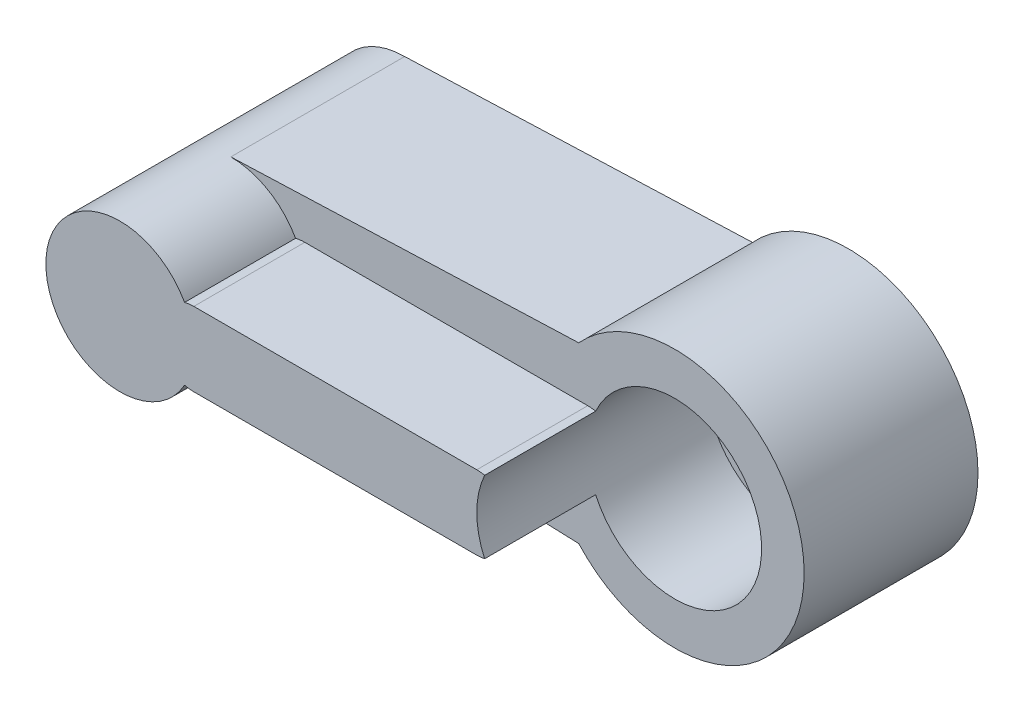
ISO-10303-21;
HEADER;
FILE_DESCRIPTION(('STEP AP214'),'2;1');
FILE_NAME('part.step','',(''),(''),'','','');
FILE_SCHEMA(('AUTOMOTIVE_DESIGN { 1 0 10303 214 1 1 1 1 }'));
ENDSEC;
DATA;
#1=APPLICATION_CONTEXT('core data for automotive mechanical design processes');
#2=APPLICATION_PROTOCOL_DEFINITION('international standard','automotive_design',2000,#1);
#3=PRODUCT_CONTEXT('',#1,'mechanical');
#4=PRODUCT('Part','Part','',(#3));
#5=PRODUCT_RELATED_PRODUCT_CATEGORY('part','',(#4));
#6=PRODUCT_DEFINITION_FORMATION('','',#4);
#7=PRODUCT_DEFINITION_CONTEXT('part definition',#1,'design');
#8=PRODUCT_DEFINITION('design','',#6,#7);
#9=PRODUCT_DEFINITION_SHAPE('','',#8);
#10=(LENGTH_UNIT() NAMED_UNIT(*) SI_UNIT(.MILLI.,.METRE.));
#11=(NAMED_UNIT(*) PLANE_ANGLE_UNIT() SI_UNIT($,.RADIAN.));
#12=(NAMED_UNIT(*) SI_UNIT($,.STERADIAN.) SOLID_ANGLE_UNIT());
#13=UNCERTAINTY_MEASURE_WITH_UNIT(LENGTH_MEASURE(1.E-05),#10,'distance_accuracy_value','');
#14=(GEOMETRIC_REPRESENTATION_CONTEXT(3) GLOBAL_UNCERTAINTY_ASSIGNED_CONTEXT((#13)) GLOBAL_UNIT_ASSIGNED_CONTEXT((#10,
#11,#12)) REPRESENTATION_CONTEXT('',''));
#15=CARTESIAN_POINT('',(0.,0.,0.));
#16=DIRECTION('',(0.,0.,1.));
#17=DIRECTION('',(1.,0.,0.));
#18=AXIS2_PLACEMENT_3D('',#15,#16,#17);
#19=CARTESIAN_POINT('',(1.06048202477386,0.,6.7));
#20=DIRECTION('',(0.,0.,-1.));
#21=DIRECTION('',(-1.,0.,0.));
#22=AXIS2_PLACEMENT_3D('',#19,#20,#21);
#23=CYLINDRICAL_SURFACE('',#22,2.35);
#24=CARTESIAN_POINT('',(1.06048202477386,0.,6.7));
#25=DIRECTION('',(0.,0.,1.));
#26=DIRECTION('',(1.,0.,0.));
#27=AXIS2_PLACEMENT_3D('',#24,#25,#26);
#28=CIRCLE('',#27,2.35);
#29=CARTESIAN_POINT('',(-1.07675201777933,-0.977103191762131,6.7));
#30=VERTEX_POINT('',#29);
#31=CARTESIAN_POINT('',(-1.07675201777933,0.977103191762131,6.7));
#32=VERTEX_POINT('',#31);
#33=EDGE_CURVE('E171',#30,#32,#28,.T.);
#34=ORIENTED_EDGE('',*,*,#33,.T.);
#35=DIRECTION('',(0.,0.,-1.));
#36=VECTOR('',#35,1.);
#37=CARTESIAN_POINT('',(-1.07675201777933,0.977103191762131,9.7));
#38=LINE('',#37,#36);
#39=CARTESIAN_POINT('',(-1.07675201777933,0.977103191762131,9.7));
#40=VERTEX_POINT('',#39);
#41=EDGE_CURVE('E203',#40,#32,#38,.T.);
#42=ORIENTED_EDGE('',*,*,#41,.F.);
#43=CARTESIAN_POINT('',(1.06048202477386,0.,9.7));
#44=DIRECTION('',(0.,0.,-1.));
#45=DIRECTION('',(1.,0.,0.));
#46=AXIS2_PLACEMENT_3D('',#43,#44,#45);
#47=CIRCLE('',#46,2.35);
#48=CARTESIAN_POINT('',(-1.07675201777933,-0.977103191762131,9.7));
#49=VERTEX_POINT('',#48);
#50=EDGE_CURVE('E244',#49,#40,#47,.T.);
#51=ORIENTED_EDGE('',*,*,#50,.F.);
#52=DIRECTION('',(0.,0.,-1.));
#53=VECTOR('',#52,1.);
#54=CARTESIAN_POINT('',(-1.07675201777933,-0.977103191762131,9.7));
#55=LINE('',#54,#53);
#56=EDGE_CURVE('E199',#49,#30,#55,.T.);
#57=ORIENTED_EDGE('',*,*,#56,.T.);
#58=EDGE_LOOP('',(#34,#42,#51,#57));
#59=FACE_BOUND('',#58,.T.);
#60=CARTESIAN_POINT('',(1.06048202477387,0.,3.5));
#61=DIRECTION('',(0.,0.,-1.));
#62=DIRECTION('',(-1.,0.,0.));
#63=AXIS2_PLACEMENT_3D('',#60,#61,#62);
#64=CIRCLE('',#63,2.35);
#65=CARTESIAN_POINT('',(-1.28951797522614,0.,3.5));
#66=VERTEX_POINT('',#65);
#67=EDGE_CURVE('E145',#66,#66,#64,.T.);
#68=ORIENTED_EDGE('',*,*,#67,.T.);
#69=EDGE_LOOP('',(#68));
#70=FACE_BOUND('',#69,.T.);
#71=ADVANCED_FACE('F45',(#59,#70),#23,.F.);
#72=CARTESIAN_POINT('',(-0.089440802020708,2.40372347859468,6.7));
#73=DIRECTION('',(-0.0371835405784303,0.999308453036425,0.));
#74=DIRECTION('',(-0.999308453036425,-0.0371835405784303,0.));
#75=AXIS2_PLACEMENT_3D('',#72,#73,#74);
#76=PLANE('',#75);
#77=DIRECTION('',(0.,0.,-1.));
#78=VECTOR('',#77,1.);
#79=CARTESIAN_POINT('',(-1.53326044509472,2.35000000000001,6.7));
#80=LINE('',#79,#78);
#81=CARTESIAN_POINT('',(-1.53326044509472,2.35000000000001,6.7));
#82=VERTEX_POINT('',#81);
#83=CARTESIAN_POINT('',(-1.53326044509472,2.35000000000001,2.));
#84=VERTEX_POINT('',#83);
#85=EDGE_CURVE('E152',#82,#84,#80,.T.);
#86=ORIENTED_EDGE('',*,*,#85,.T.);
#87=DIRECTION('',(0.999308453036425,0.0371835405784326,0.));
#88=VECTOR('',#87,1.);
#89=CARTESIAN_POINT('',(-10.9395179752261,1.99999999999993,2.));
#90=LINE('',#89,#88);
#91=CARTESIAN_POINT('',(-10.9395179752261,1.99999999999993,2.));
#92=VERTEX_POINT('',#91);
#93=EDGE_CURVE('E63',#92,#84,#90,.T.);
#94=ORIENTED_EDGE('',*,*,#93,.F.);
#95=DIRECTION('',(0.,0.,-1.));
#96=VECTOR('',#95,1.);
#97=CARTESIAN_POINT('',(-10.9395179752261,1.99999999999993,6.7));
#98=LINE('',#97,#96);
#99=CARTESIAN_POINT('',(-10.9395179752261,1.99999999999993,6.7));
#100=VERTEX_POINT('',#99);
#101=EDGE_CURVE('E49',#100,#92,#98,.T.);
#102=ORIENTED_EDGE('',*,*,#101,.F.);
#103=DIRECTION('',(0.999308453036425,0.0371835405784303,0.));
#104=VECTOR('',#103,1.);
#105=CARTESIAN_POINT('',(-0.089440802020708,2.40372347859468,6.7));
#106=LINE('',#105,#104);
#107=EDGE_CURVE('E181',#100,#82,#106,.T.);
#108=ORIENTED_EDGE('',*,*,#107,.T.);
#109=EDGE_LOOP('',(#86,#94,#102,#108));
#110=FACE_BOUND('',#109,.T.);
#111=ADVANCED_FACE('F47',(#110),#76,.T.);
#112=CARTESIAN_POINT('',(-10.9395179752261,0.,6.7));
#113=DIRECTION('',(0.,0.,-1.));
#114=DIRECTION('',(-1.,0.,0.));
#115=AXIS2_PLACEMENT_3D('',#112,#113,#114);
#116=CYLINDRICAL_SURFACE('',#115,2.);
#117=CARTESIAN_POINT('',(-10.9395179752261,0.,2.));
#118=DIRECTION('',(0.,0.,-1.));
#119=DIRECTION('',(-1.,0.,0.));
#120=AXIS2_PLACEMENT_3D('',#117,#118,#119);
#121=CIRCLE('',#120,1.99999999999999);
#122=CARTESIAN_POINT('',(-10.9395179752261,-2.00000000000005,2.));
#123=VERTEX_POINT('',#122);
#124=EDGE_CURVE('E135',#123,#92,#121,.T.);
#125=ORIENTED_EDGE('',*,*,#124,.F.);
#126=DIRECTION('',(0.,0.,-1.));
#127=VECTOR('',#126,1.);
#128=CARTESIAN_POINT('',(-10.9395179752261,-2.00000000000005,6.7));
#129=LINE('',#128,#127);
#130=CARTESIAN_POINT('',(-10.9395179752261,-2.00000000000005,6.7));
#131=VERTEX_POINT('',#130);
#132=EDGE_CURVE('E160',#131,#123,#129,.T.);
#133=ORIENTED_EDGE('',*,*,#132,.F.);
#134=CARTESIAN_POINT('',(-10.9395179752261,0.,6.7));
#135=DIRECTION('',(0.,0.,1.));
#136=DIRECTION('',(1.,0.,0.));
#137=AXIS2_PLACEMENT_3D('',#134,#135,#136);
#138=CIRCLE('',#137,2.);
#139=CARTESIAN_POINT('',(-9.18951797522613,-0.968245836551952,6.7));
#140=VERTEX_POINT('',#139);
#141=EDGE_CURVE('E11',#131,#140,#138,.T.);
#142=ORIENTED_EDGE('',*,*,#141,.T.);
#143=DIRECTION('',(0.,0.,-1.));
#144=VECTOR('',#143,1.);
#145=CARTESIAN_POINT('',(-9.18951797522613,-0.968245836551952,9.7));
#146=LINE('',#145,#144);
#147=CARTESIAN_POINT('',(-9.18951797522613,-0.968245836551952,9.7));
#148=VERTEX_POINT('',#147);
#149=EDGE_CURVE('E187',#148,#140,#146,.T.);
#150=ORIENTED_EDGE('',*,*,#149,.F.);
#151=CARTESIAN_POINT('',(-10.9395179752261,0.,9.7));
#152=DIRECTION('',(0.,0.,1.));
#153=DIRECTION('',(1.,0.,0.));
#154=AXIS2_PLACEMENT_3D('',#151,#152,#153);
#155=CIRCLE('',#154,2.);
#156=CARTESIAN_POINT('',(-9.18951797522623,0.968245836551927,9.7));
#157=VERTEX_POINT('',#156);
#158=EDGE_CURVE('E256',#157,#148,#155,.T.);
#159=ORIENTED_EDGE('',*,*,#158,.F.);
#160=DIRECTION('',(0.,0.,-1.));
#161=VECTOR('',#160,1.);
#162=CARTESIAN_POINT('',(-9.18951797522623,0.968245836551927,9.7));
#163=LINE('',#162,#161);
#164=CARTESIAN_POINT('',(-9.18951797522623,0.968245836551927,6.7));
#165=VERTEX_POINT('',#164);
#166=EDGE_CURVE('E184',#157,#165,#163,.T.);
#167=ORIENTED_EDGE('',*,*,#166,.T.);
#168=EDGE_CURVE('E56',#165,#100,#138,.T.);
#169=ORIENTED_EDGE('',*,*,#168,.T.);
#170=ORIENTED_EDGE('',*,*,#101,.T.);
#171=EDGE_LOOP('',(#125,#133,#142,#150,#159,#167,#169,#170));
#172=FACE_BOUND('',#171,.T.);
#173=ADVANCED_FACE('F157',(#172),#116,.T.);
#174=CARTESIAN_POINT('',(-0.0894408020206935,-2.40372347859467,6.7));
#175=DIRECTION('',(0.0371835405784244,0.999308453036425,0.));
#176=DIRECTION('',(-0.999308453036425,0.0371835405784244,0.));
#177=AXIS2_PLACEMENT_3D('',#174,#175,#176);
#178=PLANE('',#177);
#179=DIRECTION('',(-0.999308453036425,0.0371835405784195,0.));
#180=VECTOR('',#179,1.);
#181=CARTESIAN_POINT('',(-1.53326044509472,-2.35000000000001,2.));
#182=LINE('',#181,#180);
#183=CARTESIAN_POINT('',(-1.53326044509472,-2.35000000000001,2.));
#184=VERTEX_POINT('',#183);
#185=EDGE_CURVE('E139',#184,#123,#182,.T.);
#186=ORIENTED_EDGE('',*,*,#185,.F.);
#187=DIRECTION('',(0.,0.,-1.));
#188=VECTOR('',#187,1.);
#189=CARTESIAN_POINT('',(-1.53326044509472,-2.35000000000001,6.7));
#190=LINE('',#189,#188);
#191=CARTESIAN_POINT('',(-1.53326044509472,-2.35000000000001,6.7));
#192=VERTEX_POINT('',#191);
#193=EDGE_CURVE('E162',#192,#184,#190,.T.);
#194=ORIENTED_EDGE('',*,*,#193,.F.);
#195=DIRECTION('',(0.999308453036425,-0.0371835405784244,0.));
#196=VECTOR('',#195,1.);
#197=CARTESIAN_POINT('',(-0.0894408020206935,-2.40372347859467,6.7));
#198=LINE('',#197,#196);
#199=EDGE_CURVE('E178',#131,#192,#198,.T.);
#200=ORIENTED_EDGE('',*,*,#199,.F.);
#201=ORIENTED_EDGE('',*,*,#132,.T.);
#202=EDGE_LOOP('',(#186,#194,#200,#201));
#203=FACE_BOUND('',#202,.T.);
#204=ADVANCED_FACE('F311',(#203),#178,.F.);
#205=CARTESIAN_POINT('',(1.06048202477386,0.,6.7));
#206=DIRECTION('',(0.,0.,-1.));
#207=DIRECTION('',(-1.,0.,0.));
#208=AXIS2_PLACEMENT_3D('',#205,#206,#207);
#209=CYLINDRICAL_SURFACE('',#208,3.5);
#210=CARTESIAN_POINT('',(1.06048202477386,0.,2.));
#211=DIRECTION('',(0.,0.,-1.));
#212=DIRECTION('',(-1.,0.,0.));
#213=AXIS2_PLACEMENT_3D('',#210,#211,#212);
#214=CIRCLE('',#213,3.5);
#215=EDGE_CURVE('E154',#84,#184,#214,.T.);
#216=ORIENTED_EDGE('',*,*,#215,.F.);
#217=ORIENTED_EDGE('',*,*,#85,.F.);
#218=CARTESIAN_POINT('',(1.06048202477386,0.,6.7));
#219=DIRECTION('',(0.,0.,1.));
#220=DIRECTION('',(1.,0.,0.));
#221=AXIS2_PLACEMENT_3D('',#218,#219,#220);
#222=CIRCLE('',#221,3.5);
#223=EDGE_CURVE('E175',#192,#82,#222,.T.);
#224=ORIENTED_EDGE('',*,*,#223,.F.);
#225=ORIENTED_EDGE('',*,*,#193,.T.);
#226=EDGE_LOOP('',(#216,#217,#224,#225));
#227=FACE_BOUND('',#226,.T.);
#228=ADVANCED_FACE('F308',(#227),#209,.T.);
#229=CARTESIAN_POINT('',(0.,0.,6.7));
#230=DIRECTION('',(0.,0.,1.));
#231=DIRECTION('',(1.,0.,0.));
#232=AXIS2_PLACEMENT_3D('',#229,#230,#231);
#233=PLANE('',#232);
#234=CARTESIAN_POINT('',(-1.28951797522614,0.,6.7));
#235=DIRECTION('',(0.,0.,1.));
#236=DIRECTION('',(1.,0.,0.));
#237=AXIS2_PLACEMENT_3D('',#234,#235,#236);
#238=CIRCLE('',#237,1.);
#239=CARTESIAN_POINT('',(-1.28951797522614,1.,6.7));
#240=VERTEX_POINT('',#239);
#241=EDGE_CURVE('E219',#32,#240,#238,.T.);
#242=ORIENTED_EDGE('',*,*,#241,.F.);
#243=ORIENTED_EDGE('',*,*,#33,.F.);
#244=CARTESIAN_POINT('',(-1.28951797522614,0.,6.7));
#245=DIRECTION('',(0.,0.,1.));
#246=DIRECTION('',(1.,0.,0.));
#247=AXIS2_PLACEMENT_3D('',#244,#245,#246);
#248=CIRCLE('',#247,1.);
#249=CARTESIAN_POINT('',(-1.28951797522614,-1.,6.7));
#250=VERTEX_POINT('',#249);
#251=EDGE_CURVE('E222',#250,#30,#248,.T.);
#252=ORIENTED_EDGE('',*,*,#251,.F.);
#253=DIRECTION('',(1.,0.,0.));
#254=VECTOR('',#253,1.);
#255=CARTESIAN_POINT('',(-8.93951797522613,-1.,6.7));
#256=LINE('',#255,#254);
#257=CARTESIAN_POINT('',(-8.93951797522613,-1.00000000000005,6.7));
#258=VERTEX_POINT('',#257);
#259=EDGE_CURVE('E226',#258,#250,#256,.T.);
#260=ORIENTED_EDGE('',*,*,#259,.F.);
#261=CARTESIAN_POINT('',(-8.93951797522613,0.,6.7));
#262=DIRECTION('',(0.,0.,1.));
#263=DIRECTION('',(1.,0.,0.));
#264=AXIS2_PLACEMENT_3D('',#261,#262,#263);
#265=CIRCLE('',#264,0.999999999999952);
#266=EDGE_CURVE('E230',#140,#258,#265,.T.);
#267=ORIENTED_EDGE('',*,*,#266,.F.);
#268=ORIENTED_EDGE('',*,*,#141,.F.);
#269=ORIENTED_EDGE('',*,*,#199,.T.);
#270=ORIENTED_EDGE('',*,*,#223,.T.);
#271=ORIENTED_EDGE('',*,*,#107,.F.);
#272=ORIENTED_EDGE('',*,*,#168,.F.);
#273=CARTESIAN_POINT('',(-8.93951797522613,0.,6.7));
#274=DIRECTION('',(0.,0.,1.));
#275=DIRECTION('',(1.,0.,0.));
#276=AXIS2_PLACEMENT_3D('',#273,#274,#275);
#277=CIRCLE('',#276,1.00000000000014);
#278=CARTESIAN_POINT('',(-8.93951797522613,1.,6.7));
#279=VERTEX_POINT('',#278);
#280=EDGE_CURVE('E235',#279,#165,#277,.T.);
#281=ORIENTED_EDGE('',*,*,#280,.F.);
#282=DIRECTION('',(-1.,0.,0.));
#283=VECTOR('',#282,1.);
#284=CARTESIAN_POINT('',(-8.93951797522613,1.,6.7));
#285=LINE('',#284,#283);
#286=EDGE_CURVE('E71',#240,#279,#285,.T.);
#287=ORIENTED_EDGE('',*,*,#286,.F.);
#288=EDGE_LOOP('',(#242,#243,#252,#260,#267,#268,#269,#270,#271,#272,#281,#287));
#289=FACE_BOUND('',#288,.T.);
#290=ADVANCED_FACE('F306',(#289),#233,.T.);
#291=CARTESIAN_POINT('',(-8.93951797522613,0.,9.7));
#292=DIRECTION('',(0.,0.,-1.));
#293=DIRECTION('',(-1.,0.,0.));
#294=AXIS2_PLACEMENT_3D('',#291,#292,#293);
#295=CYLINDRICAL_SURFACE('',#294,1.00000000000014);
#296=ORIENTED_EDGE('',*,*,#280,.T.);
#297=ORIENTED_EDGE('',*,*,#166,.F.);
#298=CARTESIAN_POINT('',(-8.93951797522613,0.,9.7));
#299=DIRECTION('',(0.,0.,1.));
#300=DIRECTION('',(1.,0.,0.));
#301=AXIS2_PLACEMENT_3D('',#298,#299,#300);
#302=CIRCLE('',#301,1.00000000000014);
#303=CARTESIAN_POINT('',(-8.93951797522613,1.,9.7));
#304=VERTEX_POINT('',#303);
#305=EDGE_CURVE('E218',#304,#157,#302,.T.);
#306=ORIENTED_EDGE('',*,*,#305,.F.);
#307=DIRECTION('',(0.,0.,-1.));
#308=VECTOR('',#307,1.);
#309=CARTESIAN_POINT('',(-8.93951797522613,1.,9.7));
#310=LINE('',#309,#308);
#311=EDGE_CURVE('E211',#304,#279,#310,.T.);
#312=ORIENTED_EDGE('',*,*,#311,.T.);
#313=EDGE_LOOP('',(#296,#297,#306,#312));
#314=FACE_BOUND('',#313,.T.);
#315=ADVANCED_FACE('F333',(#314),#295,.T.);
#316=CARTESIAN_POINT('',(-8.93951797522613,0.,9.7));
#317=DIRECTION('',(0.,0.,-1.));
#318=DIRECTION('',(-1.,0.,0.));
#319=AXIS2_PLACEMENT_3D('',#316,#317,#318);
#320=CYLINDRICAL_SURFACE('',#319,0.999999999999952);
#321=ORIENTED_EDGE('',*,*,#266,.T.);
#322=DIRECTION('',(0.,0.,-1.));
#323=VECTOR('',#322,1.);
#324=CARTESIAN_POINT('',(-8.93951797522613,-1.00000000000005,9.7));
#325=LINE('',#324,#323);
#326=CARTESIAN_POINT('',(-8.93951797522613,-1.00000000000005,9.7));
#327=VERTEX_POINT('',#326);
#328=EDGE_CURVE('E191',#327,#258,#325,.T.);
#329=ORIENTED_EDGE('',*,*,#328,.F.);
#330=CARTESIAN_POINT('',(-8.93951797522613,0.,9.7));
#331=DIRECTION('',(0.,0.,1.));
#332=DIRECTION('',(1.,0.,0.));
#333=AXIS2_PLACEMENT_3D('',#330,#331,#332);
#334=CIRCLE('',#333,0.999999999999952);
#335=EDGE_CURVE('E253',#148,#327,#334,.T.);
#336=ORIENTED_EDGE('',*,*,#335,.F.);
#337=ORIENTED_EDGE('',*,*,#149,.T.);
#338=EDGE_LOOP('',(#321,#329,#336,#337));
#339=FACE_BOUND('',#338,.T.);
#340=ADVANCED_FACE('F339',(#339),#320,.T.);
#341=CARTESIAN_POINT('',(-8.93951797522613,-1.,9.7));
#342=DIRECTION('',(0.,1.,0.));
#343=DIRECTION('',(0.,0.,1.));
#344=AXIS2_PLACEMENT_3D('',#341,#342,#343);
#345=PLANE('',#344);
#346=ORIENTED_EDGE('',*,*,#259,.T.);
#347=DIRECTION('',(0.,0.,-1.));
#348=VECTOR('',#347,1.);
#349=CARTESIAN_POINT('',(-1.28951797522614,-1.,9.7));
#350=LINE('',#349,#348);
#351=CARTESIAN_POINT('',(-1.28951797522614,-1.,9.7));
#352=VERTEX_POINT('',#351);
#353=EDGE_CURVE('E195',#352,#250,#350,.T.);
#354=ORIENTED_EDGE('',*,*,#353,.F.);
#355=DIRECTION('',(1.,0.,0.));
#356=VECTOR('',#355,1.);
#357=CARTESIAN_POINT('',(-8.93951797522613,-1.,9.7));
#358=LINE('',#357,#356);
#359=EDGE_CURVE('E250',#327,#352,#358,.T.);
#360=ORIENTED_EDGE('',*,*,#359,.F.);
#361=ORIENTED_EDGE('',*,*,#328,.T.);
#362=EDGE_LOOP('',(#346,#354,#360,#361));
#363=FACE_BOUND('',#362,.T.);
#364=ADVANCED_FACE('F346',(#363),#345,.F.);
#365=CARTESIAN_POINT('',(-1.28951797522614,0.,9.7));
#366=DIRECTION('',(0.,0.,-1.));
#367=DIRECTION('',(-1.,0.,0.));
#368=AXIS2_PLACEMENT_3D('',#365,#366,#367);
#369=CYLINDRICAL_SURFACE('',#368,1.);
#370=ORIENTED_EDGE('',*,*,#251,.T.);
#371=ORIENTED_EDGE('',*,*,#56,.F.);
#372=CARTESIAN_POINT('',(-1.28951797522614,0.,9.7));
#373=DIRECTION('',(0.,0.,1.));
#374=DIRECTION('',(1.,0.,0.));
#375=AXIS2_PLACEMENT_3D('',#372,#373,#374);
#376=CIRCLE('',#375,1.);
#377=EDGE_CURVE('E247',#352,#49,#376,.T.);
#378=ORIENTED_EDGE('',*,*,#377,.F.);
#379=ORIENTED_EDGE('',*,*,#353,.T.);
#380=EDGE_LOOP('',(#370,#371,#378,#379));
#381=FACE_BOUND('',#380,.T.);
#382=ADVANCED_FACE('F354',(#381),#369,.T.);
#383=CARTESIAN_POINT('',(-1.28951797522614,0.,9.7));
#384=DIRECTION('',(0.,0.,-1.));
#385=DIRECTION('',(-1.,0.,0.));
#386=AXIS2_PLACEMENT_3D('',#383,#384,#385);
#387=CYLINDRICAL_SURFACE('',#386,1.);
#388=ORIENTED_EDGE('',*,*,#241,.T.);
#389=DIRECTION('',(0.,0.,-1.));
#390=VECTOR('',#389,1.);
#391=CARTESIAN_POINT('',(-1.28951797522614,1.,9.7));
#392=LINE('',#391,#390);
#393=CARTESIAN_POINT('',(-1.28951797522614,1.,9.7));
#394=VERTEX_POINT('',#393);
#395=EDGE_CURVE('E207',#394,#240,#392,.T.);
#396=ORIENTED_EDGE('',*,*,#395,.F.);
#397=CARTESIAN_POINT('',(-1.28951797522614,0.,9.7));
#398=DIRECTION('',(0.,0.,1.));
#399=DIRECTION('',(1.,0.,0.));
#400=AXIS2_PLACEMENT_3D('',#397,#398,#399);
#401=CIRCLE('',#400,1.);
#402=EDGE_CURVE('E241',#40,#394,#401,.T.);
#403=ORIENTED_EDGE('',*,*,#402,.F.);
#404=ORIENTED_EDGE('',*,*,#41,.T.);
#405=EDGE_LOOP('',(#388,#396,#403,#404));
#406=FACE_BOUND('',#405,.T.);
#407=ADVANCED_FACE('F362',(#406),#387,.T.);
#408=CARTESIAN_POINT('',(-8.93951797522613,1.,9.7));
#409=DIRECTION('',(0.,-1.,0.));
#410=DIRECTION('',(0.,0.,-1.));
#411=AXIS2_PLACEMENT_3D('',#408,#409,#410);
#412=PLANE('',#411);
#413=ORIENTED_EDGE('',*,*,#286,.T.);
#414=ORIENTED_EDGE('',*,*,#311,.F.);
#415=DIRECTION('',(-1.,0.,0.));
#416=VECTOR('',#415,1.);
#417=CARTESIAN_POINT('',(-8.93951797522613,1.,9.7));
#418=LINE('',#417,#416);
#419=EDGE_CURVE('E215',#394,#304,#418,.T.);
#420=ORIENTED_EDGE('',*,*,#419,.F.);
#421=ORIENTED_EDGE('',*,*,#395,.T.);
#422=EDGE_LOOP('',(#413,#414,#420,#421));
#423=FACE_BOUND('',#422,.T.);
#424=ADVANCED_FACE('F294',(#423),#412,.F.);
#425=CARTESIAN_POINT('',(-8.93951797522613,0.,9.7));
#426=DIRECTION('',(0.,0.,1.));
#427=DIRECTION('',(1.,0.,0.));
#428=AXIS2_PLACEMENT_3D('',#425,#426,#427);
#429=PLANE('',#428);
#430=ORIENTED_EDGE('',*,*,#305,.T.);
#431=ORIENTED_EDGE('',*,*,#158,.T.);
#432=ORIENTED_EDGE('',*,*,#335,.T.);
#433=ORIENTED_EDGE('',*,*,#359,.T.);
#434=ORIENTED_EDGE('',*,*,#377,.T.);
#435=ORIENTED_EDGE('',*,*,#50,.T.);
#436=ORIENTED_EDGE('',*,*,#402,.T.);
#437=ORIENTED_EDGE('',*,*,#419,.T.);
#438=EDGE_LOOP('',(#430,#431,#432,#433,#434,#435,#436,#437));
#439=FACE_BOUND('',#438,.T.);
#440=ADVANCED_FACE('F287',(#439),#429,.T.);
#441=CARTESIAN_POINT('',(-10.9395179752261,0.,2.));
#442=DIRECTION('',(0.,0.,-1.));
#443=DIRECTION('',(-1.,0.,0.));
#444=AXIS2_PLACEMENT_3D('',#441,#442,#443);
#445=PLANE('',#444);
#446=ORIENTED_EDGE('',*,*,#124,.T.);
#447=ORIENTED_EDGE('',*,*,#93,.T.);
#448=ORIENTED_EDGE('',*,*,#215,.T.);
#449=ORIENTED_EDGE('',*,*,#185,.T.);
#450=EDGE_LOOP('',(#446,#447,#448,#449));
#451=FACE_BOUND('',#450,.T.);
#452=CARTESIAN_POINT('',(1.06048202477387,0.,2.));
#453=DIRECTION('',(0.,0.,-1.));
#454=DIRECTION('',(-1.,0.,0.));
#455=AXIS2_PLACEMENT_3D('',#452,#453,#454);
#456=CIRCLE('',#455,1.45);
#457=CARTESIAN_POINT('',(-0.389517975226135,0.,2.));
#458=VERTEX_POINT('',#457);
#459=EDGE_CURVE('E270',#458,#458,#456,.T.);
#460=ORIENTED_EDGE('',*,*,#459,.F.);
#461=EDGE_LOOP('',(#460));
#462=FACE_BOUND('',#461,.T.);
#463=ADVANCED_FACE('F136',(#451,#462),#445,.T.);
#464=CARTESIAN_POINT('',(1.06048202477387,0.,3.5));
#465=DIRECTION('',(0.,0.,-1.));
#466=DIRECTION('',(-1.,0.,0.));
#467=AXIS2_PLACEMENT_3D('',#464,#465,#466);
#468=PLANE('',#467);
#469=CARTESIAN_POINT('',(1.06048202477387,0.,3.5));
#470=DIRECTION('',(0.,0.,-1.));
#471=DIRECTION('',(-1.,0.,0.));
#472=AXIS2_PLACEMENT_3D('',#469,#470,#471);
#473=CIRCLE('',#472,1.45);
#474=CARTESIAN_POINT('',(-0.389517975226135,0.,3.5));
#475=VERTEX_POINT('',#474);
#476=EDGE_CURVE('E269',#475,#475,#473,.T.);
#477=ORIENTED_EDGE('',*,*,#476,.T.);
#478=EDGE_LOOP('',(#477));
#479=FACE_BOUND('',#478,.T.);
#480=ORIENTED_EDGE('',*,*,#67,.F.);
#481=EDGE_LOOP('',(#480));
#482=FACE_BOUND('',#481,.T.);
#483=ADVANCED_FACE('F278',(#479,#482),#468,.F.);
#484=CARTESIAN_POINT('',(1.06048202477387,0.,3.5));
#485=DIRECTION('',(0.,0.,-1.));
#486=DIRECTION('',(-1.,0.,0.));
#487=AXIS2_PLACEMENT_3D('',#484,#485,#486);
#488=CYLINDRICAL_SURFACE('',#487,1.45);
#489=ORIENTED_EDGE('',*,*,#476,.F.);
#490=EDGE_LOOP('',(#489));
#491=FACE_BOUND('',#490,.T.);
#492=ORIENTED_EDGE('',*,*,#459,.T.);
#493=EDGE_LOOP('',(#492));
#494=FACE_BOUND('',#493,.T.);
#495=ADVANCED_FACE('F281',(#491,#494),#488,.F.);
#496=CLOSED_SHELL('',(#71,#111,#173,#204,#228,#290,#315,#340,#364,#382,#407,#424,#440,#463,#483,#495));
#497=MANIFOLD_SOLID_BREP('B2',#496);
#498=ADVANCED_BREP_SHAPE_REPRESENTATION('',(#18,#497),#14);
#499=SHAPE_DEFINITION_REPRESENTATION(#9,#498);
ENDSEC;
END-ISO-10303-21;
